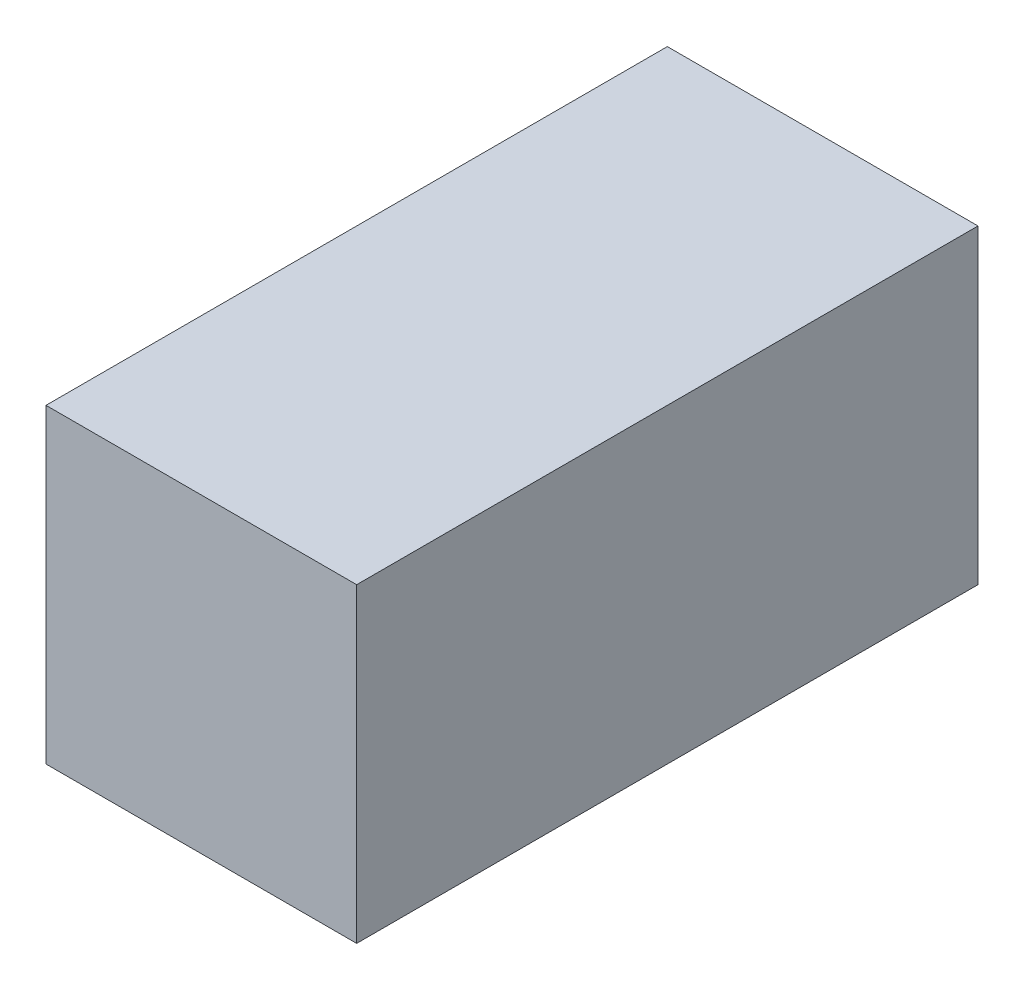
ISO-10303-21;
HEADER;
FILE_DESCRIPTION(('STEP AP214'),'2;1');
FILE_NAME('part.step','',(''),(''),'','','');
FILE_SCHEMA(('AUTOMOTIVE_DESIGN { 1 0 10303 214 1 1 1 1 }'));
ENDSEC;
DATA;
#1=APPLICATION_CONTEXT('core data for automotive mechanical design processes');
#2=APPLICATION_PROTOCOL_DEFINITION('international standard','automotive_design',2000,#1);
#3=PRODUCT_CONTEXT('',#1,'mechanical');
#4=PRODUCT('Part','Part','',(#3));
#5=PRODUCT_RELATED_PRODUCT_CATEGORY('part','',(#4));
#6=PRODUCT_DEFINITION_FORMATION('','',#4);
#7=PRODUCT_DEFINITION_CONTEXT('part definition',#1,'design');
#8=PRODUCT_DEFINITION('design','',#6,#7);
#9=PRODUCT_DEFINITION_SHAPE('','',#8);
#10=(LENGTH_UNIT() NAMED_UNIT(*) SI_UNIT(.MILLI.,.METRE.));
#11=(NAMED_UNIT(*) PLANE_ANGLE_UNIT() SI_UNIT($,.RADIAN.));
#12=(NAMED_UNIT(*) SI_UNIT($,.STERADIAN.) SOLID_ANGLE_UNIT());
#13=UNCERTAINTY_MEASURE_WITH_UNIT(LENGTH_MEASURE(1.E-05),#10,'distance_accuracy_value','');
#14=(GEOMETRIC_REPRESENTATION_CONTEXT(3) GLOBAL_UNCERTAINTY_ASSIGNED_CONTEXT((#13)) GLOBAL_UNIT_ASSIGNED_CONTEXT((#10,
#11,#12)) REPRESENTATION_CONTEXT('',''));
#15=CARTESIAN_POINT('',(0.,0.,0.));
#16=DIRECTION('',(0.,0.,1.));
#17=DIRECTION('',(1.,0.,0.));
#18=AXIS2_PLACEMENT_3D('',#15,#16,#17);
#19=CARTESIAN_POINT('',(17.5,17.5,70.));
#20=DIRECTION('',(-1.,0.,0.));
#21=DIRECTION('',(0.,-1.,0.));
#22=AXIS2_PLACEMENT_3D('',#19,#20,#21);
#23=PLANE('',#22);
#24=DIRECTION('',(0.,1.,0.));
#25=VECTOR('',#24,1.);
#26=CARTESIAN_POINT('',(17.5,17.5,0.));
#27=LINE('',#26,#25);
#28=CARTESIAN_POINT('',(17.5,-17.5,0.));
#29=VERTEX_POINT('',#28);
#30=CARTESIAN_POINT('',(17.5,17.5,0.));
#31=VERTEX_POINT('',#30);
#32=EDGE_CURVE('E96',#29,#31,#27,.T.);
#33=ORIENTED_EDGE('',*,*,#32,.T.);
#34=DIRECTION('',(0.,0.,-1.));
#35=VECTOR('',#34,1.);
#36=CARTESIAN_POINT('',(17.5,17.5,70.));
#37=LINE('',#36,#35);
#38=CARTESIAN_POINT('',(17.5,17.5,70.));
#39=VERTEX_POINT('',#38);
#40=EDGE_CURVE('E11',#39,#31,#37,.T.);
#41=ORIENTED_EDGE('',*,*,#40,.F.);
#42=DIRECTION('',(0.,1.,0.));
#43=VECTOR('',#42,1.);
#44=CARTESIAN_POINT('',(17.5,17.5,70.));
#45=LINE('',#44,#43);
#46=CARTESIAN_POINT('',(17.5,-17.5,70.));
#47=VERTEX_POINT('',#46);
#48=EDGE_CURVE('E84',#47,#39,#45,.T.);
#49=ORIENTED_EDGE('',*,*,#48,.F.);
#50=DIRECTION('',(0.,0.,-1.));
#51=VECTOR('',#50,1.);
#52=CARTESIAN_POINT('',(17.5,-17.5,70.));
#53=LINE('',#52,#51);
#54=EDGE_CURVE('E92',#47,#29,#53,.T.);
#55=ORIENTED_EDGE('',*,*,#54,.T.);
#56=EDGE_LOOP('',(#33,#41,#49,#55));
#57=FACE_BOUND('',#56,.T.);
#58=ADVANCED_FACE('F33',(#57),#23,.F.);
#59=CARTESIAN_POINT('',(-17.5,17.5,70.));
#60=DIRECTION('',(0.,-1.,0.));
#61=DIRECTION('',(0.,0.,-1.));
#62=AXIS2_PLACEMENT_3D('',#59,#60,#61);
#63=PLANE('',#62);
#64=DIRECTION('',(-1.,0.,0.));
#65=VECTOR('',#64,1.);
#66=CARTESIAN_POINT('',(-17.5,17.5,0.));
#67=LINE('',#66,#65);
#68=CARTESIAN_POINT('',(-17.5,17.5,0.));
#69=VERTEX_POINT('',#68);
#70=EDGE_CURVE('E88',#31,#69,#67,.T.);
#71=ORIENTED_EDGE('',*,*,#70,.T.);
#72=DIRECTION('',(0.,0.,-1.));
#73=VECTOR('',#72,1.);
#74=CARTESIAN_POINT('',(-17.5,17.5,70.));
#75=LINE('',#74,#73);
#76=CARTESIAN_POINT('',(-17.5,17.5,70.));
#77=VERTEX_POINT('',#76);
#78=EDGE_CURVE('E41',#77,#69,#75,.T.);
#79=ORIENTED_EDGE('',*,*,#78,.F.);
#80=DIRECTION('',(-1.,0.,0.));
#81=VECTOR('',#80,1.);
#82=CARTESIAN_POINT('',(-17.5,17.5,70.));
#83=LINE('',#82,#81);
#84=EDGE_CURVE('E79',#39,#77,#83,.T.);
#85=ORIENTED_EDGE('',*,*,#84,.F.);
#86=ORIENTED_EDGE('',*,*,#40,.T.);
#87=EDGE_LOOP('',(#71,#79,#85,#86));
#88=FACE_BOUND('',#87,.T.);
#89=ADVANCED_FACE('F87',(#88),#63,.F.);
#90=CARTESIAN_POINT('',(-17.5,17.5,70.));
#91=DIRECTION('',(1.,0.,0.));
#92=DIRECTION('',(0.,1.,0.));
#93=AXIS2_PLACEMENT_3D('',#90,#91,#92);
#94=PLANE('',#93);
#95=DIRECTION('',(0.,-1.,0.));
#96=VECTOR('',#95,1.);
#97=CARTESIAN_POINT('',(-17.5,17.5,0.));
#98=LINE('',#97,#96);
#99=CARTESIAN_POINT('',(-17.5,-17.5,0.));
#100=VERTEX_POINT('',#99);
#101=EDGE_CURVE('E66',#69,#100,#98,.T.);
#102=ORIENTED_EDGE('',*,*,#101,.T.);
#103=DIRECTION('',(0.,0.,-1.));
#104=VECTOR('',#103,1.);
#105=CARTESIAN_POINT('',(-17.5,-17.5,70.));
#106=LINE('',#105,#104);
#107=CARTESIAN_POINT('',(-17.5,-17.5,70.));
#108=VERTEX_POINT('',#107);
#109=EDGE_CURVE('E89',#108,#100,#106,.T.);
#110=ORIENTED_EDGE('',*,*,#109,.F.);
#111=DIRECTION('',(0.,-1.,0.));
#112=VECTOR('',#111,1.);
#113=CARTESIAN_POINT('',(-17.5,17.5,70.));
#114=LINE('',#113,#112);
#115=EDGE_CURVE('E82',#77,#108,#114,.T.);
#116=ORIENTED_EDGE('',*,*,#115,.F.);
#117=ORIENTED_EDGE('',*,*,#78,.T.);
#118=EDGE_LOOP('',(#102,#110,#116,#117));
#119=FACE_BOUND('',#118,.T.);
#120=ADVANCED_FACE('F90',(#119),#94,.F.);
#121=CARTESIAN_POINT('',(-17.5,-17.5,70.));
#122=DIRECTION('',(0.,1.,0.));
#123=DIRECTION('',(0.,0.,1.));
#124=AXIS2_PLACEMENT_3D('',#121,#122,#123);
#125=PLANE('',#124);
#126=DIRECTION('',(1.,0.,0.));
#127=VECTOR('',#126,1.);
#128=CARTESIAN_POINT('',(-17.5,-17.5,0.));
#129=LINE('',#128,#127);
#130=EDGE_CURVE('E72',#100,#29,#129,.T.);
#131=ORIENTED_EDGE('',*,*,#130,.T.);
#132=ORIENTED_EDGE('',*,*,#54,.F.);
#133=DIRECTION('',(1.,0.,0.));
#134=VECTOR('',#133,1.);
#135=CARTESIAN_POINT('',(-17.5,-17.5,70.));
#136=LINE('',#135,#134);
#137=EDGE_CURVE('E49',#108,#47,#136,.T.);
#138=ORIENTED_EDGE('',*,*,#137,.F.);
#139=ORIENTED_EDGE('',*,*,#109,.T.);
#140=EDGE_LOOP('',(#131,#132,#138,#139));
#141=FACE_BOUND('',#140,.T.);
#142=ADVANCED_FACE('F103',(#141),#125,.F.);
#143=CARTESIAN_POINT('',(0.,0.,70.));
#144=DIRECTION('',(0.,0.,1.));
#145=DIRECTION('',(1.,0.,0.));
#146=AXIS2_PLACEMENT_3D('',#143,#144,#145);
#147=PLANE('',#146);
#148=ORIENTED_EDGE('',*,*,#48,.T.);
#149=ORIENTED_EDGE('',*,*,#84,.T.);
#150=ORIENTED_EDGE('',*,*,#115,.T.);
#151=ORIENTED_EDGE('',*,*,#137,.T.);
#152=EDGE_LOOP('',(#148,#149,#150,#151));
#153=FACE_BOUND('',#152,.T.);
#154=ADVANCED_FACE('F80',(#153),#147,.T.);
#155=CARTESIAN_POINT('',(0.,0.,0.));
#156=DIRECTION('',(0.,0.,1.));
#157=DIRECTION('',(1.,0.,0.));
#158=AXIS2_PLACEMENT_3D('',#155,#156,#157);
#159=PLANE('',#158);
#160=ORIENTED_EDGE('',*,*,#32,.F.);
#161=ORIENTED_EDGE('',*,*,#130,.F.);
#162=ORIENTED_EDGE('',*,*,#101,.F.);
#163=ORIENTED_EDGE('',*,*,#70,.F.);
#164=EDGE_LOOP('',(#160,#161,#162,#163));
#165=FACE_BOUND('',#164,.T.);
#166=ADVANCED_FACE('F106',(#165),#159,.F.);
#167=CLOSED_SHELL('',(#58,#89,#120,#142,#154,#166));
#168=MANIFOLD_SOLID_BREP('B2',#167);
#169=ADVANCED_BREP_SHAPE_REPRESENTATION('',(#18,#168),#14);
#170=SHAPE_DEFINITION_REPRESENTATION(#9,#169);
ENDSEC;
END-ISO-10303-21;
